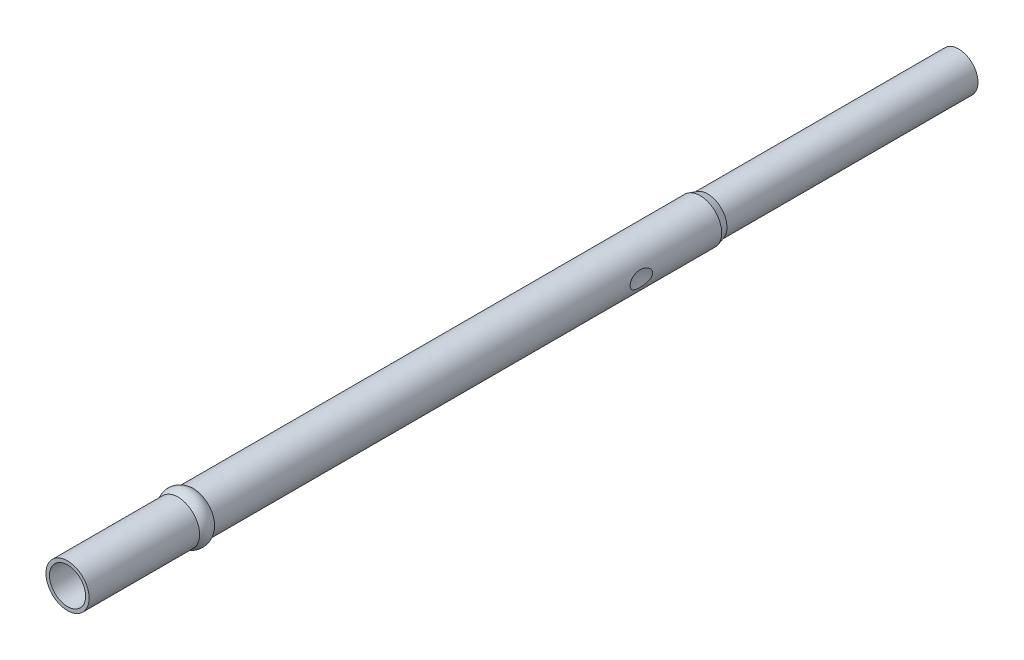
ISO-10303-21;
HEADER;
FILE_DESCRIPTION(('STEP AP214'),'2;1');
FILE_NAME('part.step','',(''),(''),'','','');
FILE_SCHEMA(('AUTOMOTIVE_DESIGN { 1 0 10303 214 1 1 1 1 }'));
ENDSEC;
DATA;
#1=APPLICATION_CONTEXT('core data for automotive mechanical design processes');
#2=APPLICATION_PROTOCOL_DEFINITION('international standard','automotive_design',2000,#1);
#3=PRODUCT_CONTEXT('',#1,'mechanical');
#4=PRODUCT('Part','Part','',(#3));
#5=PRODUCT_RELATED_PRODUCT_CATEGORY('part','',(#4));
#6=PRODUCT_DEFINITION_FORMATION('','',#4);
#7=PRODUCT_DEFINITION_CONTEXT('part definition',#1,'design');
#8=PRODUCT_DEFINITION('design','',#6,#7);
#9=PRODUCT_DEFINITION_SHAPE('','',#8);
#10=(LENGTH_UNIT() NAMED_UNIT(*) SI_UNIT(.MILLI.,.METRE.));
#11=(NAMED_UNIT(*) PLANE_ANGLE_UNIT() SI_UNIT($,.RADIAN.));
#12=(NAMED_UNIT(*) SI_UNIT($,.STERADIAN.) SOLID_ANGLE_UNIT());
#13=UNCERTAINTY_MEASURE_WITH_UNIT(LENGTH_MEASURE(1.E-05),#10,'distance_accuracy_value','');
#14=(GEOMETRIC_REPRESENTATION_CONTEXT(3) GLOBAL_UNCERTAINTY_ASSIGNED_CONTEXT((#13)) GLOBAL_UNIT_ASSIGNED_CONTEXT((#10,
#11,#12)) REPRESENTATION_CONTEXT('',''));
#15=CARTESIAN_POINT('',(0.,0.,0.));
#16=DIRECTION('',(0.,0.,1.));
#17=DIRECTION('',(1.,0.,0.));
#18=AXIS2_PLACEMENT_3D('',#15,#16,#17);
#19=CARTESIAN_POINT('',(-0.9098697740013,0.,-7.5));
#20=DIRECTION('',(1.,0.,0.));
#21=DIRECTION('',(0.,0.,-1.));
#22=AXIS2_PLACEMENT_3D('',#19,#20,#21);
#23=SPHERICAL_SURFACE('',#22,0.53);
#24=CARTESIAN_POINT('',(-0.43,0.,-7.27500000000013));
#25=CARTESIAN_POINT('',(-0.429997574518787,0.0121192132429723,-7.2750078570585));
#26=CARTESIAN_POINT('',(-0.429464766005483,0.0242527874081889,-7.27713657935527));
#27=CARTESIAN_POINT('',(-0.427573391272547,0.0470604236945862,-7.28500448515132));
#28=CARTESIAN_POINT('',(-0.426217974832986,0.0577398636844386,-7.29072989977262));
#29=CARTESIAN_POINT('',(-0.422366529001698,0.0820078278008041,-7.30806884835162));
#30=CARTESIAN_POINT('',(-0.419637292260694,0.0944473830516414,-7.32119325479502));
#31=CARTESIAN_POINT('',(-0.415152886826133,0.112277483785009,-7.34599508776297));
#32=CARTESIAN_POINT('',(-0.413341899534484,0.118666585998696,-7.35701774809022));
#33=CARTESIAN_POINT('',(-0.410023354639295,0.129667175837881,-7.37998299989754));
#34=CARTESIAN_POINT('',(-0.408516276417462,0.134275865390332,-7.39192700429841));
#35=CARTESIAN_POINT('',(-0.40551846389353,0.143121917333483,-7.42038601681729));
#36=CARTESIAN_POINT('',(-0.40419677855845,0.146736426516288,-7.43711027704398));
#37=CARTESIAN_POINT('',(-0.402485267385419,0.151364354365558,-7.47096353945722));
#38=CARTESIAN_POINT('',(-0.402096486260132,0.152374857029135,-7.48809297372914));
#39=CARTESIAN_POINT('',(-0.402294603156043,0.151853649964607,-7.52251583071561));
#40=CARTESIAN_POINT('',(-0.402892888152505,0.150292270871607,-7.53980884677626));
#41=CARTESIAN_POINT('',(-0.405016038513214,0.144467239031365,-7.57383806834153));
#42=CARTESIAN_POINT('',(-0.406539525603129,0.140207605470322,-7.5905750631101));
#43=CARTESIAN_POINT('',(-0.411028743632083,0.126606781665484,-7.62873726936663));
#44=CARTESIAN_POINT('',(-0.414313896120399,0.116001743140423,-7.64972892369682));
#45=CARTESIAN_POINT('',(-0.420219368923115,0.0917768058393974,-7.68168869364331));
#46=CARTESIAN_POINT('',(-0.422776212899336,0.0797714104769899,-7.69382857434648));
#47=CARTESIAN_POINT('',(-0.426607770574294,0.0549820046395622,-7.71097565460924));
#48=CARTESIAN_POINT('',(-0.428040636115169,0.0429440824301638,-7.71696260457993));
#49=CARTESIAN_POINT('',(-0.429627615598731,0.0204107393052699,-7.72350782715125));
#50=CARTESIAN_POINT('',(-0.430002043473779,0.0102104664180094,-7.72500661959052));
#51=CARTESIAN_POINT('',(-0.429997574518786,-0.012119213243019,-7.72499214294149));
#52=CARTESIAN_POINT('',(-0.429464766005481,-0.0242527874082364,-7.72286342064472));
#53=CARTESIAN_POINT('',(-0.427573391272542,-0.0470604236946332,-7.71499551484866));
#54=CARTESIAN_POINT('',(-0.42621797483298,-0.0577398636844845,-7.70927010022736));
#55=CARTESIAN_POINT('',(-0.422366529001689,-0.0820078278008503,-7.69193115164834));
#56=CARTESIAN_POINT('',(-0.419637292260684,-0.0944473830516877,-7.67880674520493));
#57=CARTESIAN_POINT('',(-0.415152886826121,-0.112277483785053,-7.65400491223696));
#58=CARTESIAN_POINT('',(-0.413341899534472,-0.118666585998737,-7.6429822519097));
#59=CARTESIAN_POINT('',(-0.410023354639283,-0.129667175837918,-7.62001700010237));
#60=CARTESIAN_POINT('',(-0.40851627641745,-0.134275865390367,-7.60807299570149));
#61=CARTESIAN_POINT('',(-0.40551846389352,-0.14312191733351,-7.5796139831826));
#62=CARTESIAN_POINT('',(-0.404196778558441,-0.14673642651631,-7.5628897229559));
#63=CARTESIAN_POINT('',(-0.402485267385416,-0.151364354365569,-7.52903646054266));
#64=CARTESIAN_POINT('',(-0.40209648626013,-0.15237485702914,-7.51190702627073));
#65=CARTESIAN_POINT('',(-0.402294603156047,-0.151853649964598,-7.47748416928425));
#66=CARTESIAN_POINT('',(-0.402892888152511,-0.150292270871591,-7.46019115322361));
#67=CARTESIAN_POINT('',(-0.405016038513226,-0.144467239031334,-7.42616193165833));
#68=CARTESIAN_POINT('',(-0.406539525603143,-0.140207605470281,-7.40942493688976));
#69=CARTESIAN_POINT('',(-0.4110287436321,-0.126606781665428,-7.37126273063325));
#70=CARTESIAN_POINT('',(-0.414313896120416,-0.116001743140364,-7.35027107630308));
#71=CARTESIAN_POINT('',(-0.420219368923128,-0.0917768058393364,-7.31831130635662));
#72=CARTESIAN_POINT('',(-0.422776212899348,-0.0797714104769276,-7.30617142565346));
#73=CARTESIAN_POINT('',(-0.426607770574302,-0.0549820046395,-7.28902434539073));
#74=CARTESIAN_POINT('',(-0.428040636115176,-0.0429440824301019,-7.28303739542005));
#75=CARTESIAN_POINT('',(-0.429627615598732,-0.0204107393052428,-7.27649217284874));
#76=CARTESIAN_POINT('',(-0.430002043473778,-0.0102104664180186,-7.27499338040948));
#77=CARTESIAN_POINT('',(-0.43,0.,-7.27500000000013));
#78=B_SPLINE_CURVE_WITH_KNOTS('',3,(#24,#25,#26,#27,#28,#29,#30,#31,#32,#33,#34,#35,#36,#37,#38,
#39,#40,#41,#42,#43,#44,#45,#46,#47,#48,#49,#50,#51,#52,#53,#54,#55,#56,#57,#58,#59,#60,#61,#62,
#63,#64,#65,#66,#67,#68,#69,#70,#71,#72,#73,#74,#75,#76,#77),.UNSPECIFIED.,.T.,.F.,(4,2,2,2,2,2,
2,2,2,2,2,2,2,2,2,2,2,2,2,2,2,2,2,2,2,2,4),(0.,0.0362227151874188,0.0723076004124087,
0.126123105394495,0.164591156860831,0.203119420625858,0.254344265665312,0.305626448124616,
0.357504377925528,0.409305214061796,0.47941292671213,0.530372766193793,0.570174251384745,
0.600691976386832,0.636914691574256,0.672999576799251,0.726815081781359,0.765283133247711,
0.803811397012755,0.85503624205222,0.906318424511536,0.958196354312457,1.00999719044873,
1.08010490309902,1.13106474258066,1.17086622777159,1.20138395277358),.UNSPECIFIED.);
#79=CARTESIAN_POINT('',(-0.43,0.,-7.27500000000013));
#80=VERTEX_POINT('',#79);
#81=EDGE_CURVE('E28',#80,#80,#78,.T.);
#82=ORIENTED_EDGE('',*,*,#81,.T.);
#83=EDGE_LOOP('',(#82));
#84=FACE_BOUND('',#83,.T.);
#85=CARTESIAN_POINT('',(-0.3798697740013,0.,-7.49999999999997));
#86=VERTEX_POINT('',#85);
#87=VERTEX_LOOP('',#86);
#88=FACE_BOUND('',#87,.T.);
#89=ADVANCED_FACE('F24',(#84,#88),#23,.F.);
#90=CARTESIAN_POINT('',(0.,0.,-17.75));
#91=DIRECTION('',(0.,0.,1.));
#92=DIRECTION('',(1.,0.,0.));
#93=AXIS2_PLACEMENT_3D('',#90,#91,#92);
#94=CYLINDRICAL_SURFACE('',#93,0.385);
#95=CARTESIAN_POINT('',(0.,0.,-12.7499999999995));
#96=DIRECTION('',(0.,0.,1.));
#97=DIRECTION('',(0.,1.,0.));
#98=AXIS2_PLACEMENT_3D('',#95,#96,#97);
#99=CIRCLE('',#98,0.384999999999989);
#100=CARTESIAN_POINT('',(0.,0.384999999999989,-12.7499999999995));
#101=VERTEX_POINT('',#100);
#102=EDGE_CURVE('E104',#101,#101,#99,.F.);
#103=ORIENTED_EDGE('',*,*,#102,.T.);
#104=EDGE_LOOP('',(#103));
#105=FACE_BOUND('',#104,.T.);
#106=CARTESIAN_POINT('',(0.,0.,-17.75));
#107=DIRECTION('',(0.,0.,1.));
#108=DIRECTION('',(1.,0.,0.));
#109=AXIS2_PLACEMENT_3D('',#106,#107,#108);
#110=CIRCLE('',#109,0.385);
#111=CARTESIAN_POINT('',(0.385,0.,-17.75));
#112=VERTEX_POINT('',#111);
#113=EDGE_CURVE('E88',#112,#112,#110,.T.);
#114=ORIENTED_EDGE('',*,*,#113,.T.);
#115=EDGE_LOOP('',(#114));
#116=FACE_BOUND('',#115,.T.);
#117=ADVANCED_FACE('F45',(#105,#116),#94,.T.);
#118=CARTESIAN_POINT('',(0.,0.,-12.7499999999995));
#119=DIRECTION('',(0.,0.,1.));
#120=DIRECTION('',(1.,0.,0.));
#121=AXIS2_PLACEMENT_3D('',#118,#119,#120);
#122=CONICAL_SURFACE('',#121,0.38499999999999,0.291456794479753);
#123=ORIENTED_EDGE('',*,*,#102,.F.);
#124=EDGE_LOOP('',(#123));
#125=FACE_BOUND('',#124,.T.);
#126=CARTESIAN_POINT('',(0.,0.,-12.6));
#127=DIRECTION('',(0.,0.,1.));
#128=DIRECTION('',(0.,1.,0.));
#129=AXIS2_PLACEMENT_3D('',#126,#127,#128);
#130=CIRCLE('',#129,0.43);
#131=CARTESIAN_POINT('',(0.,0.43,-12.6));
#132=VERTEX_POINT('',#131);
#133=EDGE_CURVE('E87',#132,#132,#130,.F.);
#134=ORIENTED_EDGE('',*,*,#133,.T.);
#135=EDGE_LOOP('',(#134));
#136=FACE_BOUND('',#135,.T.);
#137=ADVANCED_FACE('F51',(#125,#136),#122,.T.);
#138=CARTESIAN_POINT('',(0.9098697740013,0.,-11.));
#139=DIRECTION('',(1.,0.,0.));
#140=DIRECTION('',(0.,0.,-1.));
#141=AXIS2_PLACEMENT_3D('',#138,#139,#140);
#142=SPHERICAL_SURFACE('',#141,0.53);
#143=CARTESIAN_POINT('',(0.3798697740013,0.,-11.));
#144=VERTEX_POINT('',#143);
#145=VERTEX_LOOP('',#144);
#146=FACE_BOUND('',#145,.T.);
#147=CARTESIAN_POINT('',(0.43,0.,-10.7750000000001));
#148=CARTESIAN_POINT('',(0.429997574518788,-0.0121192132429524,-10.7750078570585));
#149=CARTESIAN_POINT('',(0.429464766005485,-0.0242527874081687,-10.7771365793553));
#150=CARTESIAN_POINT('',(0.427573391272549,-0.047060423694566,-10.7850044851513));
#151=CARTESIAN_POINT('',(0.426217974832988,-0.0577398636844186,-10.7907298997726));
#152=CARTESIAN_POINT('',(0.422366529001702,-0.0820078278007834,-10.8080688483516));
#153=CARTESIAN_POINT('',(0.419637292260699,-0.0944473830516211,-10.821193254795));
#154=CARTESIAN_POINT('',(0.415152886826138,-0.11227748378499,-10.8459950877629));
#155=CARTESIAN_POINT('',(0.41334189953449,-0.118666585998677,-10.8570177480902));
#156=CARTESIAN_POINT('',(0.410023354639301,-0.129667175837864,-10.8799829998975));
#157=CARTESIAN_POINT('',(0.408516276417468,-0.134275865390317,-10.8919270042984));
#158=CARTESIAN_POINT('',(0.405518463893535,-0.143121917333471,-10.9203860168172));
#159=CARTESIAN_POINT('',(0.404196778558453,-0.146736426516278,-10.9371102770439));
#160=CARTESIAN_POINT('',(0.402485267385421,-0.151364354365553,-10.9709635394572));
#161=CARTESIAN_POINT('',(0.402096486260133,-0.152374857029133,-10.9880929737291));
#162=CARTESIAN_POINT('',(0.402294603156042,-0.151853649964611,-11.0225158307155));
#163=CARTESIAN_POINT('',(0.402892888152502,-0.150292270871614,-11.0398088467762));
#164=CARTESIAN_POINT('',(0.405016038513209,-0.14446723903138,-11.0738380683415));
#165=CARTESIAN_POINT('',(0.406539525603122,-0.14020760547034,-11.09057506311));
#166=CARTESIAN_POINT('',(0.411028743632075,-0.12660678166551,-11.1287372693666));
#167=CARTESIAN_POINT('',(0.414313896120392,-0.11600174314045,-11.1497289236968));
#168=CARTESIAN_POINT('',(0.420219368923109,-0.0917768058394252,-11.1816886936433));
#169=CARTESIAN_POINT('',(0.422776212899331,-0.0797714104770183,-11.1938285743465));
#170=CARTESIAN_POINT('',(0.426607770574291,-0.0549820046395902,-11.2109756546092));
#171=CARTESIAN_POINT('',(0.428040636115167,-0.0429440824301914,-11.2169626045799));
#172=CARTESIAN_POINT('',(0.429627615598729,-0.0204107393053061,-11.2235078271512));
#173=CARTESIAN_POINT('',(0.430002043473778,-0.0102104664180555,-11.2250066195905));
#174=CARTESIAN_POINT('',(0.429997574518787,0.0121192132429618,-11.2249921429415));
#175=CARTESIAN_POINT('',(0.429464766005484,0.0242527874081784,-11.2228634206447));
#176=CARTESIAN_POINT('',(0.427573391272548,0.0470604236945755,-11.2149955148487));
#177=CARTESIAN_POINT('',(0.426217974832987,0.0577398636844278,-11.2092701002274));
#178=CARTESIAN_POINT('',(0.4223665290017,0.0820078278007931,-11.1919311516484));
#179=CARTESIAN_POINT('',(0.419637292260697,0.0944473830516318,-11.178806745205));
#180=CARTESIAN_POINT('',(0.415152886826136,0.112277483785,-11.154004912237));
#181=CARTESIAN_POINT('',(0.413341899534487,0.118666585998686,-11.1429822519098));
#182=CARTESIAN_POINT('',(0.410023354639298,0.129667175837871,-11.1200170001025));
#183=CARTESIAN_POINT('',(0.408516276417465,0.134275865390323,-11.1080729957016));
#184=CARTESIAN_POINT('',(0.405518463893532,0.143121917333476,-11.0796139831827));
#185=CARTESIAN_POINT('',(0.404196778558451,0.146736426516283,-11.062889722956));
#186=CARTESIAN_POINT('',(0.40248526738542,0.151364354365556,-11.0290364605428));
#187=CARTESIAN_POINT('',(0.402096486260132,0.152374857029134,-11.0119070262709));
#188=CARTESIAN_POINT('',(0.402294603156042,0.151853649964608,-10.9774841692844));
#189=CARTESIAN_POINT('',(0.402892888152503,0.150292270871611,-10.9601911532238));
#190=CARTESIAN_POINT('',(0.405016038513211,0.144467239031374,-10.9261619316585));
#191=CARTESIAN_POINT('',(0.406539525603125,0.140207605470331,-10.9094249368899));
#192=CARTESIAN_POINT('',(0.411028743632078,0.126606781665497,-10.8712627306334));
#193=CARTESIAN_POINT('',(0.414313896120395,0.116001743140438,-10.8502710763032));
#194=CARTESIAN_POINT('',(0.420219368923111,0.091776805839413,-10.8183113063567));
#195=CARTESIAN_POINT('',(0.422776212899333,0.0797714104770054,-10.8061714256535));
#196=CARTESIAN_POINT('',(0.426607770574293,0.0549820046395774,-10.7890243453908));
#197=CARTESIAN_POINT('',(0.428040636115168,0.0429440824301789,-10.7830373954201));
#198=CARTESIAN_POINT('',(0.429627615598729,0.0204107393053007,-10.7764921728488));
#199=CARTESIAN_POINT('',(0.430002043473778,0.0102104664180573,-10.7749933804095));
#200=CARTESIAN_POINT('',(0.43,0.,-10.7750000000001));
#201=B_SPLINE_CURVE_WITH_KNOTS('',3,(#147,#148,#149,#150,#151,#152,#153,#154,#155,#156,#157,
#158,#159,#160,#161,#162,#163,#164,#165,#166,#167,#168,#169,#170,#171,#172,#173,#174,#175,#176,
#177,#178,#179,#180,#181,#182,#183,#184,#185,#186,#187,#188,#189,#190,#191,#192,#193,#194,#195,
#196,#197,#198,#199,#200),.UNSPECIFIED.,.T.,.F.,(4,2,2,2,2,2,2,2,2,2,2,2,2,2,2,2,2,2,2,2,2,2,2,
2,2,2,4),(0.,0.0362227151874165,0.0723076004124048,0.12612310539448,0.164591156860807,
0.203119420625829,0.254344265665277,0.305626448124577,0.357504377925483,0.409305214061747,
0.479412926712105,0.530372766193779,0.570174251384737,0.600691976386797,0.636914691574215,
0.672999576799204,0.726815081781284,0.765283133247616,0.80381139701264,0.855036242052091,
0.906318424511391,0.958196354312298,1.00999719044857,1.08010490309891,1.13106474258058,
1.17086622777154,1.20138395277358),.UNSPECIFIED.);
#202=CARTESIAN_POINT('',(0.43,0.,-10.7750000000001));
#203=VERTEX_POINT('',#202);
#204=EDGE_CURVE('E82',#203,#203,#201,.T.);
#205=ORIENTED_EDGE('',*,*,#204,.T.);
#206=EDGE_LOOP('',(#205));
#207=FACE_BOUND('',#206,.T.);
#208=ADVANCED_FACE('F92',(#146,#207),#142,.F.);
#209=CARTESIAN_POINT('',(0.4095353346829,-0.4084372273104,-17.75));
#210=DIRECTION('',(0.,0.,1.));
#211=DIRECTION('',(0.,1.,0.));
#212=AXIS2_PLACEMENT_3D('',#209,#210,#211);
#213=PLANE('',#212);
#214=CARTESIAN_POINT('',(0.,0.,-17.75));
#215=DIRECTION('',(0.,0.,1.));
#216=DIRECTION('',(1.,0.,0.));
#217=AXIS2_PLACEMENT_3D('',#214,#215,#216);
#218=CIRCLE('',#217,0.325);
#219=CARTESIAN_POINT('',(0.325,0.,-17.75));
#220=VERTEX_POINT('',#219);
#221=EDGE_CURVE('E78',#220,#220,#218,.F.);
#222=ORIENTED_EDGE('',*,*,#221,.F.);
#223=EDGE_LOOP('',(#222));
#224=FACE_BOUND('',#223,.T.);
#225=ORIENTED_EDGE('',*,*,#113,.F.);
#226=EDGE_LOOP('',(#225));
#227=FACE_BOUND('',#226,.T.);
#228=ADVANCED_FACE('F97',(#224,#227),#213,.F.);
#229=CARTESIAN_POINT('',(0.,0.,-12.6));
#230=DIRECTION('',(0.,0.,1.));
#231=DIRECTION('',(1.,0.,0.));
#232=AXIS2_PLACEMENT_3D('',#229,#230,#231);
#233=CYLINDRICAL_SURFACE('',#232,0.43);
#234=ORIENTED_EDGE('',*,*,#133,.F.);
#235=EDGE_LOOP('',(#234));
#236=FACE_BOUND('',#235,.T.);
#237=ORIENTED_EDGE('',*,*,#204,.F.);
#238=EDGE_LOOP('',(#237));
#239=FACE_BOUND('',#238,.T.);
#240=CARTESIAN_POINT('',(0.,0.,-2.50000000000003));
#241=DIRECTION('',(0.,0.,1.));
#242=DIRECTION('',(0.,1.,0.));
#243=AXIS2_PLACEMENT_3D('',#240,#241,#242);
#244=CIRCLE('',#243,0.430000000000021);
#245=CARTESIAN_POINT('',(0.,0.430000000000021,-2.50000000000003));
#246=VERTEX_POINT('',#245);
#247=EDGE_CURVE('E81',#246,#246,#244,.F.);
#248=ORIENTED_EDGE('',*,*,#247,.T.);
#249=EDGE_LOOP('',(#248));
#250=FACE_BOUND('',#249,.T.);
#251=ORIENTED_EDGE('',*,*,#81,.F.);
#252=EDGE_LOOP('',(#251));
#253=FACE_BOUND('',#252,.T.);
#254=ADVANCED_FACE('F89',(#236,#239,#250,#253),#233,.T.);
#255=CARTESIAN_POINT('',(0.,0.,-17.75));
#256=DIRECTION('',(0.,0.,1.));
#257=DIRECTION('',(1.,0.,0.));
#258=AXIS2_PLACEMENT_3D('',#255,#256,#257);
#259=CYLINDRICAL_SURFACE('',#258,0.325);
#260=CARTESIAN_POINT('',(0.,0.,-12.7499999999991));
#261=DIRECTION('',(0.,0.,1.));
#262=DIRECTION('',(0.,1.,0.));
#263=AXIS2_PLACEMENT_3D('',#260,#261,#262);
#264=CIRCLE('',#263,0.324999999999987);
#265=CARTESIAN_POINT('',(0.,0.324999999999987,-12.7499999999991));
#266=VERTEX_POINT('',#265);
#267=EDGE_CURVE('E136',#266,#266,#264,.F.);
#268=ORIENTED_EDGE('',*,*,#267,.F.);
#269=EDGE_LOOP('',(#268));
#270=FACE_BOUND('',#269,.T.);
#271=ORIENTED_EDGE('',*,*,#221,.T.);
#272=EDGE_LOOP('',(#271));
#273=FACE_BOUND('',#272,.T.);
#274=ADVANCED_FACE('F117',(#270,#273),#259,.F.);
#275=CARTESIAN_POINT('',(0.,0.,-2.35));
#276=DIRECTION('',(0.,0.,1.));
#277=DIRECTION('',(0.,1.,0.));
#278=AXIS2_PLACEMENT_3D('',#275,#276,#277);
#279=TOROIDAL_SURFACE('',#278,0.2529545454544,0.2320454545456);
#280=ORIENTED_EDGE('',*,*,#247,.F.);
#281=EDGE_LOOP('',(#280));
#282=FACE_BOUND('',#281,.T.);
#283=CARTESIAN_POINT('',(0.,0.,-2.2));
#284=DIRECTION('',(0.,0.,1.));
#285=DIRECTION('',(0.,1.,0.));
#286=AXIS2_PLACEMENT_3D('',#283,#284,#285);
#287=CIRCLE('',#286,0.43);
#288=CARTESIAN_POINT('',(0.,0.43,-2.2));
#289=VERTEX_POINT('',#288);
#290=EDGE_CURVE('E74',#289,#289,#287,.F.);
#291=ORIENTED_EDGE('',*,*,#290,.T.);
#292=EDGE_LOOP('',(#291));
#293=FACE_BOUND('',#292,.T.);
#294=ADVANCED_FACE('F122',(#282,#293),#279,.T.);
#295=CARTESIAN_POINT('',(0.,0.,-12.7499999999991));
#296=DIRECTION('',(0.,0.,1.));
#297=DIRECTION('',(1.,0.,0.));
#298=AXIS2_PLACEMENT_3D('',#295,#296,#297);
#299=CONICAL_SURFACE('',#298,0.324999999999987,0.291456794474463);
#300=CARTESIAN_POINT('',(0.,0.,-12.6333333333333));
#301=DIRECTION('',(0.,0.,1.));
#302=DIRECTION('',(0.,1.,0.));
#303=AXIS2_PLACEMENT_3D('',#300,#301,#302);
#304=CIRCLE('',#303,0.36);
#305=CARTESIAN_POINT('',(0.,0.36,-12.6333333333333));
#306=VERTEX_POINT('',#305);
#307=EDGE_CURVE('E71',#306,#306,#304,.F.);
#308=ORIENTED_EDGE('',*,*,#307,.F.);
#309=EDGE_LOOP('',(#308));
#310=FACE_BOUND('',#309,.T.);
#311=ORIENTED_EDGE('',*,*,#267,.T.);
#312=EDGE_LOOP('',(#311));
#313=FACE_BOUND('',#312,.T.);
#314=ADVANCED_FACE('F127',(#310,#313),#299,.F.);
#315=CARTESIAN_POINT('',(0.,0.,-2.2));
#316=DIRECTION('',(0.,0.,1.));
#317=DIRECTION('',(1.,0.,0.));
#318=AXIS2_PLACEMENT_3D('',#315,#316,#317);
#319=CYLINDRICAL_SURFACE('',#318,0.43);
#320=ORIENTED_EDGE('',*,*,#290,.F.);
#321=EDGE_LOOP('',(#320));
#322=FACE_BOUND('',#321,.T.);
#323=CARTESIAN_POINT('',(0.,0.,0.));
#324=DIRECTION('',(0.,0.,1.));
#325=DIRECTION('',(1.,0.,0.));
#326=AXIS2_PLACEMENT_3D('',#323,#324,#325);
#327=CIRCLE('',#326,0.43);
#328=CARTESIAN_POINT('',(0.43,0.,0.));
#329=VERTEX_POINT('',#328);
#330=EDGE_CURVE('E38',#329,#329,#327,.T.);
#331=ORIENTED_EDGE('',*,*,#330,.F.);
#332=EDGE_LOOP('',(#331));
#333=FACE_BOUND('',#332,.T.);
#334=ADVANCED_FACE('F63',(#322,#333),#319,.T.);
#335=CARTESIAN_POINT('',(0.,0.,-12.6333333333333));
#336=DIRECTION('',(0.,0.,1.));
#337=DIRECTION('',(1.,0.,0.));
#338=AXIS2_PLACEMENT_3D('',#335,#336,#337);
#339=CYLINDRICAL_SURFACE('',#338,0.36);
#340=CARTESIAN_POINT('',(0.,0.,-3.67761376907083E-13));
#341=DIRECTION('',(0.,0.,1.));
#342=DIRECTION('',(1.,0.,0.));
#343=AXIS2_PLACEMENT_3D('',#340,#341,#342);
#344=CIRCLE('',#343,0.36);
#345=CARTESIAN_POINT('',(0.36000000000003,0.,-3.68628738645072E-13));
#346=VERTEX_POINT('',#345);
#347=EDGE_CURVE('E13',#346,#346,#344,.F.);
#348=ORIENTED_EDGE('',*,*,#347,.F.);
#349=EDGE_LOOP('',(#348));
#350=FACE_BOUND('',#349,.T.);
#351=ORIENTED_EDGE('',*,*,#307,.T.);
#352=EDGE_LOOP('',(#351));
#353=FACE_BOUND('',#352,.T.);
#354=ADVANCED_FACE('F58',(#350,#353),#339,.F.);
#355=CARTESIAN_POINT('',(0.4546636848953,-0.4534372273104,0.));
#356=DIRECTION('',(0.,0.,1.));
#357=DIRECTION('',(0.,1.,0.));
#358=AXIS2_PLACEMENT_3D('',#355,#356,#357);
#359=PLANE('',#358);
#360=ORIENTED_EDGE('',*,*,#347,.T.);
#361=EDGE_LOOP('',(#360));
#362=FACE_BOUND('',#361,.T.);
#363=ORIENTED_EDGE('',*,*,#330,.T.);
#364=EDGE_LOOP('',(#363));
#365=FACE_BOUND('',#364,.T.);
#366=ADVANCED_FACE('F26',(#362,#365),#359,.T.);
#367=CLOSED_SHELL('',(#89,#117,#137,#208,#228,#254,#274,#294,#314,#334,#354,#366));
#368=MANIFOLD_SOLID_BREP('B1',#367);
#369=ADVANCED_BREP_SHAPE_REPRESENTATION('',(#18,#368),#14);
#370=SHAPE_DEFINITION_REPRESENTATION(#9,#369);
ENDSEC;
END-ISO-10303-21;
